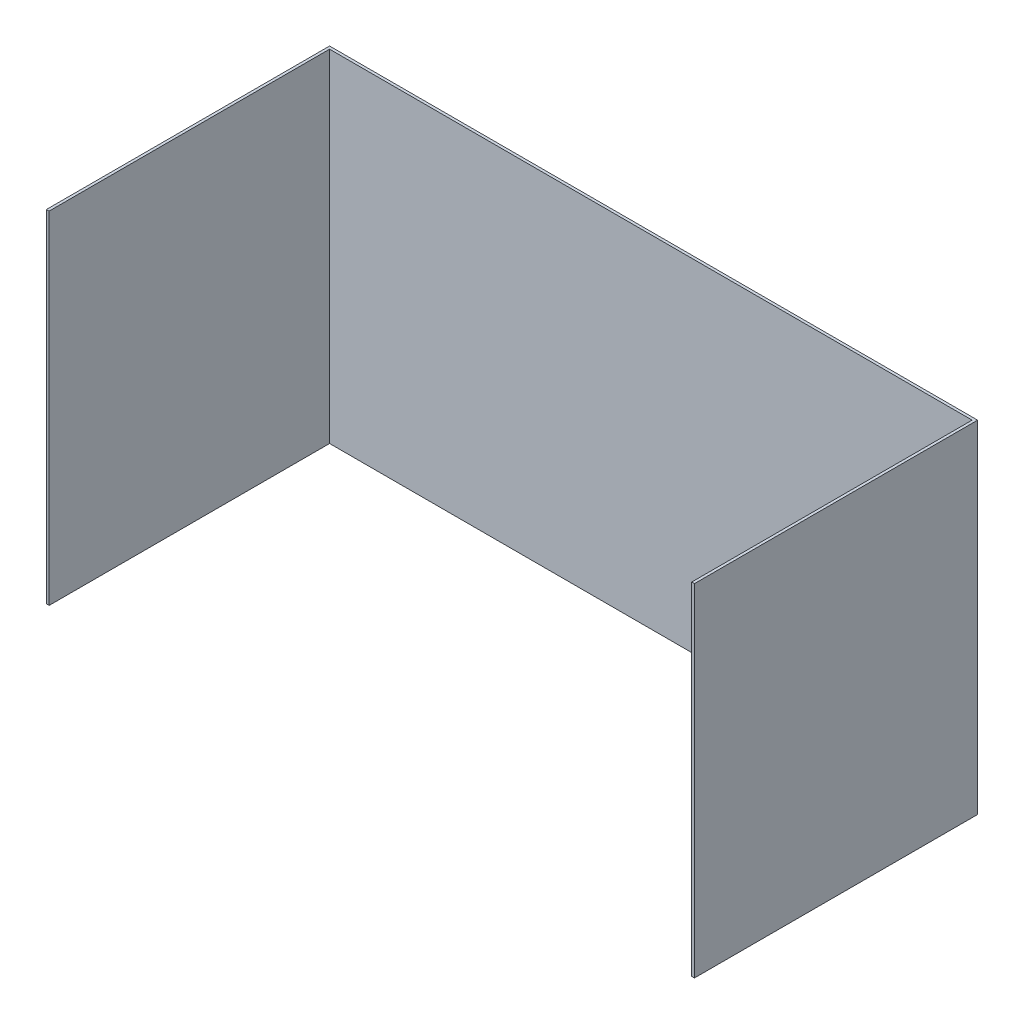
ISO-10303-21;
HEADER;
FILE_DESCRIPTION(('STEP AP214'),'2;1');
FILE_NAME('part.step','',(''),(''),'','','');
FILE_SCHEMA(('AUTOMOTIVE_DESIGN { 1 0 10303 214 1 1 1 1 }'));
ENDSEC;
DATA;
#1=APPLICATION_CONTEXT('core data for automotive mechanical design processes');
#2=APPLICATION_PROTOCOL_DEFINITION('international standard','automotive_design',2000,#1);
#3=PRODUCT_CONTEXT('',#1,'mechanical');
#4=PRODUCT('Part','Part','',(#3));
#5=PRODUCT_RELATED_PRODUCT_CATEGORY('part','',(#4));
#6=PRODUCT_DEFINITION_FORMATION('','',#4);
#7=PRODUCT_DEFINITION_CONTEXT('part definition',#1,'design');
#8=PRODUCT_DEFINITION('design','',#6,#7);
#9=PRODUCT_DEFINITION_SHAPE('','',#8);
#10=(LENGTH_UNIT() NAMED_UNIT(*) SI_UNIT(.MILLI.,.METRE.));
#11=(NAMED_UNIT(*) PLANE_ANGLE_UNIT() SI_UNIT($,.RADIAN.));
#12=(NAMED_UNIT(*) SI_UNIT($,.STERADIAN.) SOLID_ANGLE_UNIT());
#13=UNCERTAINTY_MEASURE_WITH_UNIT(LENGTH_MEASURE(1.E-05),#10,'distance_accuracy_value','');
#14=(GEOMETRIC_REPRESENTATION_CONTEXT(3) GLOBAL_UNCERTAINTY_ASSIGNED_CONTEXT((#13)) GLOBAL_UNIT_ASSIGNED_CONTEXT((#10,
#11,#12)) REPRESENTATION_CONTEXT('',''));
#15=CARTESIAN_POINT('',(0.,0.,0.));
#16=DIRECTION('',(0.,0.,1.));
#17=DIRECTION('',(1.,0.,0.));
#18=AXIS2_PLACEMENT_3D('',#15,#16,#17);
#19=CARTESIAN_POINT('',(0.,0.,330.2));
#20=DIRECTION('',(0.,0.,-1.));
#21=DIRECTION('',(-1.,0.,0.));
#22=AXIS2_PLACEMENT_3D('',#19,#20,#21);
#23=PLANE('',#22);
#24=DIRECTION('',(-1.,0.,0.));
#25=VECTOR('',#24,1.);
#26=CARTESIAN_POINT('',(-377.825,199.136,330.2));
#27=LINE('',#26,#25);
#28=CARTESIAN_POINT('',(377.825,199.136,330.2));
#29=VERTEX_POINT('',#28);
#30=CARTESIAN_POINT('',(374.65,199.136,330.2));
#31=VERTEX_POINT('',#30);
#32=EDGE_CURVE('E92',#29,#31,#27,.T.);
#33=ORIENTED_EDGE('',*,*,#32,.T.);
#34=DIRECTION('',(0.,1.,0.));
#35=VECTOR('',#34,1.);
#36=CARTESIAN_POINT('',(374.65,199.136,330.2));
#37=LINE('',#36,#35);
#38=CARTESIAN_POINT('',(374.65,-199.136,330.2));
#39=VERTEX_POINT('',#38);
#40=EDGE_CURVE('E118',#39,#31,#37,.T.);
#41=ORIENTED_EDGE('',*,*,#40,.F.);
#42=DIRECTION('',(1.,0.,0.));
#43=VECTOR('',#42,1.);
#44=CARTESIAN_POINT('',(-377.825,-199.136,330.2));
#45=LINE('',#44,#43);
#46=CARTESIAN_POINT('',(377.825,-199.136,330.2));
#47=VERTEX_POINT('',#46);
#48=EDGE_CURVE('E63',#39,#47,#45,.T.);
#49=ORIENTED_EDGE('',*,*,#48,.T.);
#50=DIRECTION('',(0.,1.,0.));
#51=VECTOR('',#50,1.);
#52=CARTESIAN_POINT('',(377.825,-199.136,330.2));
#53=LINE('',#52,#51);
#54=EDGE_CURVE('E147',#47,#29,#53,.T.);
#55=ORIENTED_EDGE('',*,*,#54,.T.);
#56=EDGE_LOOP('',(#33,#41,#49,#55));
#57=FACE_BOUND('',#56,.T.);
#58=ADVANCED_FACE('F39',(#57),#23,.F.);
#59=CARTESIAN_POINT('',(377.825,-199.136,330.2));
#60=DIRECTION('',(-1.,0.,0.));
#61=DIRECTION('',(0.,-1.,0.));
#62=AXIS2_PLACEMENT_3D('',#59,#60,#61);
#63=PLANE('',#62);
#64=DIRECTION('',(0.,1.,0.));
#65=VECTOR('',#64,1.);
#66=CARTESIAN_POINT('',(377.825,-199.136,0.));
#67=LINE('',#66,#65);
#68=CARTESIAN_POINT('',(377.825,-199.136,0.));
#69=VERTEX_POINT('',#68);
#70=CARTESIAN_POINT('',(377.825,199.136,0.));
#71=VERTEX_POINT('',#70);
#72=EDGE_CURVE('E142',#69,#71,#67,.T.);
#73=ORIENTED_EDGE('',*,*,#72,.T.);
#74=DIRECTION('',(0.,0.,-1.));
#75=VECTOR('',#74,1.);
#76=CARTESIAN_POINT('',(377.825,199.136,330.2));
#77=LINE('',#76,#75);
#78=EDGE_CURVE('E11',#29,#71,#77,.T.);
#79=ORIENTED_EDGE('',*,*,#78,.F.);
#80=ORIENTED_EDGE('',*,*,#54,.F.);
#81=DIRECTION('',(0.,0.,-1.));
#82=VECTOR('',#81,1.);
#83=CARTESIAN_POINT('',(377.825,-199.136,330.2));
#84=LINE('',#83,#82);
#85=EDGE_CURVE('E156',#47,#69,#84,.T.);
#86=ORIENTED_EDGE('',*,*,#85,.T.);
#87=EDGE_LOOP('',(#73,#79,#80,#86));
#88=FACE_BOUND('',#87,.T.);
#89=ADVANCED_FACE('F41',(#88),#63,.F.);
#90=CARTESIAN_POINT('',(-377.825,199.136,330.2));
#91=DIRECTION('',(0.,-1.,0.));
#92=DIRECTION('',(0.,0.,-1.));
#93=AXIS2_PLACEMENT_3D('',#90,#91,#92);
#94=PLANE('',#93);
#95=DIRECTION('',(-1.,0.,0.));
#96=VECTOR('',#95,1.);
#97=CARTESIAN_POINT('',(-374.65,199.136,3.17499999999998));
#98=LINE('',#97,#96);
#99=CARTESIAN_POINT('',(374.65,199.136,3.17499999999998));
#100=VERTEX_POINT('',#99);
#101=CARTESIAN_POINT('',(-374.65,199.136,3.17499999999998));
#102=VERTEX_POINT('',#101);
#103=EDGE_CURVE('E126',#100,#102,#98,.T.);
#104=ORIENTED_EDGE('',*,*,#103,.F.);
#105=DIRECTION('',(0.,0.,1.));
#106=VECTOR('',#105,1.);
#107=CARTESIAN_POINT('',(374.65,199.136,3.17499999999998));
#108=LINE('',#107,#106);
#109=EDGE_CURVE('E113',#100,#31,#108,.T.);
#110=ORIENTED_EDGE('',*,*,#109,.T.);
#111=ORIENTED_EDGE('',*,*,#32,.F.);
#112=ORIENTED_EDGE('',*,*,#78,.T.);
#113=DIRECTION('',(-1.,0.,0.));
#114=VECTOR('',#113,1.);
#115=CARTESIAN_POINT('',(-377.825,199.136,0.));
#116=LINE('',#115,#114);
#117=CARTESIAN_POINT('',(-377.825,199.136,0.));
#118=VERTEX_POINT('',#117);
#119=EDGE_CURVE('E159',#71,#118,#116,.T.);
#120=ORIENTED_EDGE('',*,*,#119,.T.);
#121=DIRECTION('',(0.,0.,-1.));
#122=VECTOR('',#121,1.);
#123=CARTESIAN_POINT('',(-377.825,199.136,330.2));
#124=LINE('',#123,#122);
#125=CARTESIAN_POINT('',(-377.825,199.136,330.2));
#126=VERTEX_POINT('',#125);
#127=EDGE_CURVE('E47',#126,#118,#124,.T.);
#128=ORIENTED_EDGE('',*,*,#127,.F.);
#129=CARTESIAN_POINT('',(-374.65,199.136,330.2));
#130=VERTEX_POINT('',#129);
#131=EDGE_CURVE('E149',#130,#126,#27,.T.);
#132=ORIENTED_EDGE('',*,*,#131,.F.);
#133=DIRECTION('',(0.,0.,1.));
#134=VECTOR('',#133,1.);
#135=CARTESIAN_POINT('',(-374.65,199.136,3.17499999999998));
#136=LINE('',#135,#134);
#137=EDGE_CURVE('E54',#102,#130,#136,.T.);
#138=ORIENTED_EDGE('',*,*,#137,.F.);
#139=EDGE_LOOP('',(#104,#110,#111,#112,#120,#128,#132,#138));
#140=FACE_BOUND('',#139,.T.);
#141=ADVANCED_FACE('F131',(#140),#94,.F.);
#142=CARTESIAN_POINT('',(-377.825,-199.136,330.2));
#143=DIRECTION('',(1.,0.,0.));
#144=DIRECTION('',(0.,1.,0.));
#145=AXIS2_PLACEMENT_3D('',#142,#143,#144);
#146=PLANE('',#145);
#147=DIRECTION('',(0.,-1.,0.));
#148=VECTOR('',#147,1.);
#149=CARTESIAN_POINT('',(-377.825,-199.136,0.));
#150=LINE('',#149,#148);
#151=CARTESIAN_POINT('',(-377.825,-199.136,0.));
#152=VERTEX_POINT('',#151);
#153=EDGE_CURVE('E161',#118,#152,#150,.T.);
#154=ORIENTED_EDGE('',*,*,#153,.T.);
#155=DIRECTION('',(0.,0.,-1.));
#156=VECTOR('',#155,1.);
#157=CARTESIAN_POINT('',(-377.825,-199.136,330.2));
#158=LINE('',#157,#156);
#159=CARTESIAN_POINT('',(-377.825,-199.136,330.2));
#160=VERTEX_POINT('',#159);
#161=EDGE_CURVE('E165',#160,#152,#158,.T.);
#162=ORIENTED_EDGE('',*,*,#161,.F.);
#163=DIRECTION('',(0.,-1.,0.));
#164=VECTOR('',#163,1.);
#165=CARTESIAN_POINT('',(-377.825,-199.136,330.2));
#166=LINE('',#165,#164);
#167=EDGE_CURVE('E151',#126,#160,#166,.T.);
#168=ORIENTED_EDGE('',*,*,#167,.F.);
#169=ORIENTED_EDGE('',*,*,#127,.T.);
#170=EDGE_LOOP('',(#154,#162,#168,#169));
#171=FACE_BOUND('',#170,.T.);
#172=ADVANCED_FACE('F171',(#171),#146,.F.);
#173=CARTESIAN_POINT('',(-377.825,-199.136,330.2));
#174=DIRECTION('',(0.,1.,0.));
#175=DIRECTION('',(0.,0.,1.));
#176=AXIS2_PLACEMENT_3D('',#173,#174,#175);
#177=PLANE('',#176);
#178=ORIENTED_EDGE('',*,*,#48,.F.);
#179=DIRECTION('',(0.,0.,1.));
#180=VECTOR('',#179,1.);
#181=CARTESIAN_POINT('',(374.65,-199.136,3.17499999999998));
#182=LINE('',#181,#180);
#183=CARTESIAN_POINT('',(374.65,-199.136,3.17499999999998));
#184=VERTEX_POINT('',#183);
#185=EDGE_CURVE('E140',#184,#39,#182,.T.);
#186=ORIENTED_EDGE('',*,*,#185,.F.);
#187=DIRECTION('',(1.,0.,0.));
#188=VECTOR('',#187,1.);
#189=CARTESIAN_POINT('',(-374.65,-199.136,3.17499999999998));
#190=LINE('',#189,#188);
#191=CARTESIAN_POINT('',(-374.65,-199.136,3.17499999999998));
#192=VERTEX_POINT('',#191);
#193=EDGE_CURVE('E120',#192,#184,#190,.T.);
#194=ORIENTED_EDGE('',*,*,#193,.F.);
#195=DIRECTION('',(0.,0.,1.));
#196=VECTOR('',#195,1.);
#197=CARTESIAN_POINT('',(-374.65,-199.136,3.17499999999998));
#198=LINE('',#197,#196);
#199=CARTESIAN_POINT('',(-374.65,-199.136,330.2));
#200=VERTEX_POINT('',#199);
#201=EDGE_CURVE('E143',#192,#200,#198,.T.);
#202=ORIENTED_EDGE('',*,*,#201,.T.);
#203=EDGE_CURVE('E153',#160,#200,#45,.T.);
#204=ORIENTED_EDGE('',*,*,#203,.F.);
#205=ORIENTED_EDGE('',*,*,#161,.T.);
#206=DIRECTION('',(1.,0.,0.));
#207=VECTOR('',#206,1.);
#208=CARTESIAN_POINT('',(-377.825,-199.136,0.));
#209=LINE('',#208,#207);
#210=EDGE_CURVE('E85',#152,#69,#209,.T.);
#211=ORIENTED_EDGE('',*,*,#210,.T.);
#212=ORIENTED_EDGE('',*,*,#85,.F.);
#213=EDGE_LOOP('',(#178,#186,#194,#202,#204,#205,#211,#212));
#214=FACE_BOUND('',#213,.T.);
#215=ADVANCED_FACE('F179',(#214),#177,.F.);
#216=ORIENTED_EDGE('',*,*,#203,.T.);
#217=DIRECTION('',(0.,-1.,0.));
#218=VECTOR('',#217,1.);
#219=CARTESIAN_POINT('',(-374.65,199.136,330.2));
#220=LINE('',#219,#218);
#221=EDGE_CURVE('E129',#130,#200,#220,.T.);
#222=ORIENTED_EDGE('',*,*,#221,.F.);
#223=ORIENTED_EDGE('',*,*,#131,.T.);
#224=ORIENTED_EDGE('',*,*,#167,.T.);
#225=EDGE_LOOP('',(#216,#222,#223,#224));
#226=FACE_BOUND('',#225,.T.);
#227=ADVANCED_FACE('F182',(#226),#23,.F.);
#228=CARTESIAN_POINT('',(0.,0.,0.));
#229=DIRECTION('',(0.,0.,-1.));
#230=DIRECTION('',(-1.,0.,0.));
#231=AXIS2_PLACEMENT_3D('',#228,#229,#230);
#232=PLANE('',#231);
#233=ORIENTED_EDGE('',*,*,#72,.F.);
#234=ORIENTED_EDGE('',*,*,#210,.F.);
#235=ORIENTED_EDGE('',*,*,#153,.F.);
#236=ORIENTED_EDGE('',*,*,#119,.F.);
#237=EDGE_LOOP('',(#233,#234,#235,#236));
#238=FACE_BOUND('',#237,.T.);
#239=ADVANCED_FACE('F175',(#238),#232,.T.);
#240=CARTESIAN_POINT('',(374.65,199.136,3.17499999999998));
#241=DIRECTION('',(1.,0.,0.));
#242=DIRECTION('',(0.,0.,-1.));
#243=AXIS2_PLACEMENT_3D('',#240,#241,#242);
#244=PLANE('',#243);
#245=ORIENTED_EDGE('',*,*,#40,.T.);
#246=ORIENTED_EDGE('',*,*,#109,.F.);
#247=DIRECTION('',(0.,1.,0.));
#248=VECTOR('',#247,1.);
#249=CARTESIAN_POINT('',(374.65,199.136,3.17499999999998));
#250=LINE('',#249,#248);
#251=EDGE_CURVE('E116',#184,#100,#250,.T.);
#252=ORIENTED_EDGE('',*,*,#251,.F.);
#253=ORIENTED_EDGE('',*,*,#185,.T.);
#254=EDGE_LOOP('',(#245,#246,#252,#253));
#255=FACE_BOUND('',#254,.T.);
#256=ADVANCED_FACE('F115',(#255),#244,.F.);
#257=CARTESIAN_POINT('',(-374.65,199.136,3.17499999999998));
#258=DIRECTION('',(-1.,0.,0.));
#259=DIRECTION('',(0.,0.,1.));
#260=AXIS2_PLACEMENT_3D('',#257,#258,#259);
#261=PLANE('',#260);
#262=ORIENTED_EDGE('',*,*,#221,.T.);
#263=ORIENTED_EDGE('',*,*,#201,.F.);
#264=DIRECTION('',(0.,-1.,0.));
#265=VECTOR('',#264,1.);
#266=CARTESIAN_POINT('',(-374.65,199.136,3.17499999999998));
#267=LINE('',#266,#265);
#268=EDGE_CURVE('E133',#102,#192,#267,.T.);
#269=ORIENTED_EDGE('',*,*,#268,.F.);
#270=ORIENTED_EDGE('',*,*,#137,.T.);
#271=EDGE_LOOP('',(#262,#263,#269,#270));
#272=FACE_BOUND('',#271,.T.);
#273=ADVANCED_FACE('F198',(#272),#261,.F.);
#274=CARTESIAN_POINT('',(0.,0.,3.17499999999998));
#275=DIRECTION('',(0.,0.,1.));
#276=DIRECTION('',(1.,0.,0.));
#277=AXIS2_PLACEMENT_3D('',#274,#275,#276);
#278=PLANE('',#277);
#279=ORIENTED_EDGE('',*,*,#251,.T.);
#280=ORIENTED_EDGE('',*,*,#103,.T.);
#281=ORIENTED_EDGE('',*,*,#268,.T.);
#282=ORIENTED_EDGE('',*,*,#193,.T.);
#283=EDGE_LOOP('',(#279,#280,#281,#282));
#284=FACE_BOUND('',#283,.T.);
#285=ADVANCED_FACE('F124',(#284),#278,.T.);
#286=CLOSED_SHELL('',(#58,#89,#141,#172,#215,#227,#239,#256,#273,#285));
#287=MANIFOLD_SOLID_BREP('B2',#286);
#288=ADVANCED_BREP_SHAPE_REPRESENTATION('',(#18,#287),#14);
#289=SHAPE_DEFINITION_REPRESENTATION(#9,#288);
ENDSEC;
END-ISO-10303-21;
